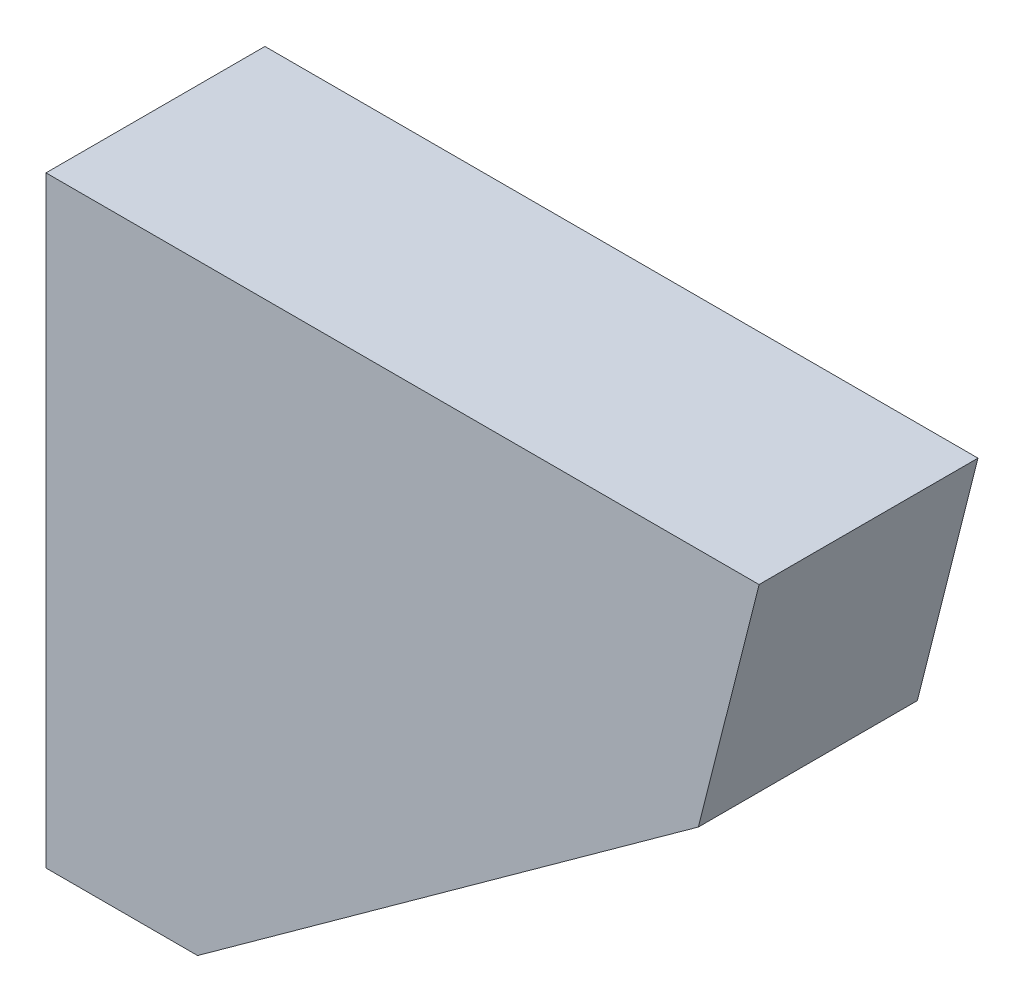
ISO-10303-21;
HEADER;
FILE_DESCRIPTION(('STEP AP214'),'2;1');
FILE_NAME('part.step','',(''),(''),'','','');
FILE_SCHEMA(('AUTOMOTIVE_DESIGN { 1 0 10303 214 1 1 1 1 }'));
ENDSEC;
DATA;
#1=APPLICATION_CONTEXT('core data for automotive mechanical design processes');
#2=APPLICATION_PROTOCOL_DEFINITION('international standard','automotive_design',2000,#1);
#3=PRODUCT_CONTEXT('',#1,'mechanical');
#4=PRODUCT('Part','Part','',(#3));
#5=PRODUCT_RELATED_PRODUCT_CATEGORY('part','',(#4));
#6=PRODUCT_DEFINITION_FORMATION('','',#4);
#7=PRODUCT_DEFINITION_CONTEXT('part definition',#1,'design');
#8=PRODUCT_DEFINITION('design','',#6,#7);
#9=PRODUCT_DEFINITION_SHAPE('','',#8);
#10=(LENGTH_UNIT() NAMED_UNIT(*) SI_UNIT(.MILLI.,.METRE.));
#11=(NAMED_UNIT(*) PLANE_ANGLE_UNIT() SI_UNIT($,.RADIAN.));
#12=(NAMED_UNIT(*) SI_UNIT($,.STERADIAN.) SOLID_ANGLE_UNIT());
#13=UNCERTAINTY_MEASURE_WITH_UNIT(LENGTH_MEASURE(1.E-05),#10,'distance_accuracy_value','');
#14=(GEOMETRIC_REPRESENTATION_CONTEXT(3) GLOBAL_UNCERTAINTY_ASSIGNED_CONTEXT((#13)) GLOBAL_UNIT_ASSIGNED_CONTEXT((#10,
#11,#12)) REPRESENTATION_CONTEXT('',''));
#15=CARTESIAN_POINT('',(0.,0.,0.));
#16=DIRECTION('',(0.,0.,1.));
#17=DIRECTION('',(1.,0.,0.));
#18=AXIS2_PLACEMENT_3D('',#15,#16,#17);
#19=CARTESIAN_POINT('',(0.,0.,8.));
#20=DIRECTION('',(0.,-1.,0.));
#21=DIRECTION('',(0.,0.,-1.));
#22=AXIS2_PLACEMENT_3D('',#19,#20,#21);
#23=PLANE('',#22);
#24=DIRECTION('',(-1.,0.,0.));
#25=VECTOR('',#24,1.);
#26=CARTESIAN_POINT('',(0.,0.,8.));
#27=LINE('',#26,#25);
#28=CARTESIAN_POINT('',(26.0559498624795,0.,8.));
#29=VERTEX_POINT('',#28);
#30=CARTESIAN_POINT('',(0.,0.,8.));
#31=VERTEX_POINT('',#30);
#32=EDGE_CURVE('E78',#29,#31,#27,.T.);
#33=ORIENTED_EDGE('',*,*,#32,.F.);
#34=DIRECTION('',(0.,0.,-1.));
#35=VECTOR('',#34,1.);
#36=CARTESIAN_POINT('',(26.0559498624795,0.,8.));
#37=LINE('',#36,#35);
#38=CARTESIAN_POINT('',(26.0559498624795,0.,0.));
#39=VERTEX_POINT('',#38);
#40=EDGE_CURVE('E114',#29,#39,#37,.T.);
#41=ORIENTED_EDGE('',*,*,#40,.T.);
#42=DIRECTION('',(-1.,0.,0.));
#43=VECTOR('',#42,1.);
#44=CARTESIAN_POINT('',(0.,0.,0.));
#45=LINE('',#44,#43);
#46=CARTESIAN_POINT('',(0.,0.,0.));
#47=VERTEX_POINT('',#46);
#48=EDGE_CURVE('E99',#39,#47,#45,.T.);
#49=ORIENTED_EDGE('',*,*,#48,.T.);
#50=DIRECTION('',(0.,0.,-1.));
#51=VECTOR('',#50,1.);
#52=CARTESIAN_POINT('',(0.,0.,8.));
#53=LINE('',#52,#51);
#54=EDGE_CURVE('E94',#31,#47,#53,.T.);
#55=ORIENTED_EDGE('',*,*,#54,.F.);
#56=EDGE_LOOP('',(#33,#41,#49,#55));
#57=FACE_BOUND('',#56,.T.);
#58=ADVANCED_FACE('F31',(#57),#23,.F.);
#59=CARTESIAN_POINT('',(0.,0.,8.));
#60=DIRECTION('',(1.,0.,0.));
#61=DIRECTION('',(0.,1.,0.));
#62=AXIS2_PLACEMENT_3D('',#59,#60,#61);
#63=PLANE('',#62);
#64=DIRECTION('',(0.,-1.,0.));
#65=VECTOR('',#64,1.);
#66=CARTESIAN_POINT('',(0.,0.,0.));
#67=LINE('',#66,#65);
#68=CARTESIAN_POINT('',(0.,-22.,0.));
#69=VERTEX_POINT('',#68);
#70=EDGE_CURVE('E118',#47,#69,#67,.T.);
#71=ORIENTED_EDGE('',*,*,#70,.T.);
#72=DIRECTION('',(0.,0.,1.));
#73=VECTOR('',#72,1.);
#74=CARTESIAN_POINT('',(0.,-22.,8.));
#75=LINE('',#74,#73);
#76=CARTESIAN_POINT('',(0.,-22.,8.));
#77=VERTEX_POINT('',#76);
#78=EDGE_CURVE('E96',#69,#77,#75,.T.);
#79=ORIENTED_EDGE('',*,*,#78,.T.);
#80=DIRECTION('',(0.,-1.,0.));
#81=VECTOR('',#80,1.);
#82=CARTESIAN_POINT('',(0.,0.,8.));
#83=LINE('',#82,#81);
#84=EDGE_CURVE('E81',#31,#77,#83,.T.);
#85=ORIENTED_EDGE('',*,*,#84,.F.);
#86=ORIENTED_EDGE('',*,*,#54,.T.);
#87=EDGE_LOOP('',(#71,#79,#85,#86));
#88=FACE_BOUND('',#87,.T.);
#89=ADVANCED_FACE('F93',(#88),#63,.F.);
#90=CARTESIAN_POINT('',(36.,0.,8.));
#91=DIRECTION('',(-0.585490553844359,0.810679228399881,0.));
#92=DIRECTION('',(-0.810679228399881,-0.585490553844359,0.));
#93=AXIS2_PLACEMENT_3D('',#90,#91,#92);
#94=PLANE('',#93);
#95=DIRECTION('',(0.810679228399881,0.585490553844359,0.));
#96=VECTOR('',#95,1.);
#97=CARTESIAN_POINT('',(36.,0.,0.));
#98=LINE('',#97,#96);
#99=CARTESIAN_POINT('',(5.53846153846153,-22.,0.));
#100=VERTEX_POINT('',#99);
#101=CARTESIAN_POINT('',(23.8398115740017,-8.78235830766542,0.));
#102=VERTEX_POINT('',#101);
#103=EDGE_CURVE('E88',#100,#102,#98,.T.);
#104=ORIENTED_EDGE('',*,*,#103,.T.);
#105=DIRECTION('',(0.,0.,1.));
#106=VECTOR('',#105,1.);
#107=CARTESIAN_POINT('',(23.8398115740017,-8.78235830766542,8.));
#108=LINE('',#107,#106);
#109=CARTESIAN_POINT('',(23.8398115740017,-8.78235830766542,8.));
#110=VERTEX_POINT('',#109);
#111=EDGE_CURVE('E39',#102,#110,#108,.T.);
#112=ORIENTED_EDGE('',*,*,#111,.T.);
#113=DIRECTION('',(0.810679228399881,0.585490553844359,0.));
#114=VECTOR('',#113,1.);
#115=CARTESIAN_POINT('',(36.,0.,8.));
#116=LINE('',#115,#114);
#117=CARTESIAN_POINT('',(5.53846153846153,-22.,8.));
#118=VERTEX_POINT('',#117);
#119=EDGE_CURVE('E97',#118,#110,#116,.T.);
#120=ORIENTED_EDGE('',*,*,#119,.F.);
#121=DIRECTION('',(0.,0.,-1.));
#122=VECTOR('',#121,1.);
#123=CARTESIAN_POINT('',(5.53846153846153,-22.,8.));
#124=LINE('',#123,#122);
#125=EDGE_CURVE('E101',#118,#100,#124,.T.);
#126=ORIENTED_EDGE('',*,*,#125,.T.);
#127=EDGE_LOOP('',(#104,#112,#120,#126));
#128=FACE_BOUND('',#127,.T.);
#129=ADVANCED_FACE('F120',(#128),#94,.F.);
#130=CARTESIAN_POINT('',(0.,0.,8.));
#131=DIRECTION('',(0.,0.,-1.));
#132=DIRECTION('',(-1.,0.,0.));
#133=AXIS2_PLACEMENT_3D('',#130,#131,#132);
#134=PLANE('',#133);
#135=ORIENTED_EDGE('',*,*,#119,.T.);
#136=DIRECTION('',(-0.244670244468048,-0.969606348716811,0.));
#137=VECTOR('',#136,1.);
#138=CARTESIAN_POINT('',(26.0559498624795,0.,8.));
#139=LINE('',#138,#137);
#140=EDGE_CURVE('E11',#110,#29,#139,.F.);
#141=ORIENTED_EDGE('',*,*,#140,.T.);
#142=ORIENTED_EDGE('',*,*,#32,.T.);
#143=ORIENTED_EDGE('',*,*,#84,.T.);
#144=DIRECTION('',(-1.,0.,0.));
#145=VECTOR('',#144,1.);
#146=CARTESIAN_POINT('',(5.53846153846153,-22.,8.));
#147=LINE('',#146,#145);
#148=EDGE_CURVE('E112',#77,#118,#147,.F.);
#149=ORIENTED_EDGE('',*,*,#148,.T.);
#150=EDGE_LOOP('',(#135,#141,#142,#143,#149));
#151=FACE_BOUND('',#150,.T.);
#152=ADVANCED_FACE('F80',(#151),#134,.F.);
#153=CARTESIAN_POINT('',(0.,0.,0.));
#154=DIRECTION('',(0.,0.,-1.));
#155=DIRECTION('',(-1.,0.,0.));
#156=AXIS2_PLACEMENT_3D('',#153,#154,#155);
#157=PLANE('',#156);
#158=ORIENTED_EDGE('',*,*,#48,.F.);
#159=DIRECTION('',(0.244670244468048,0.969606348716811,0.));
#160=VECTOR('',#159,1.);
#161=CARTESIAN_POINT('',(24.4961487645614,-6.18135258157369,0.));
#162=LINE('',#161,#160);
#163=EDGE_CURVE('E53',#39,#102,#162,.F.);
#164=ORIENTED_EDGE('',*,*,#163,.T.);
#165=ORIENTED_EDGE('',*,*,#103,.F.);
#166=DIRECTION('',(1.,0.,0.));
#167=VECTOR('',#166,1.);
#168=CARTESIAN_POINT('',(0.,-22.,0.));
#169=LINE('',#168,#167);
#170=EDGE_CURVE('E104',#100,#69,#169,.F.);
#171=ORIENTED_EDGE('',*,*,#170,.T.);
#172=ORIENTED_EDGE('',*,*,#70,.F.);
#173=EDGE_LOOP('',(#158,#164,#165,#171,#172));
#174=FACE_BOUND('',#173,.T.);
#175=ADVANCED_FACE('F117',(#174),#157,.T.);
#176=CARTESIAN_POINT('',(5.53846153846153,-22.,8.));
#177=DIRECTION('',(0.,1.,0.));
#178=DIRECTION('',(-1.,0.,0.));
#179=AXIS2_PLACEMENT_3D('',#176,#177,#178);
#180=PLANE('',#179);
#181=ORIENTED_EDGE('',*,*,#148,.F.);
#182=ORIENTED_EDGE('',*,*,#78,.F.);
#183=ORIENTED_EDGE('',*,*,#170,.F.);
#184=ORIENTED_EDGE('',*,*,#125,.F.);
#185=EDGE_LOOP('',(#181,#182,#183,#184));
#186=FACE_BOUND('',#185,.T.);
#187=ADVANCED_FACE('F123',(#186),#180,.F.);
#188=CARTESIAN_POINT('',(26.0559498624795,0.,8.));
#189=DIRECTION('',(-0.969606348716811,0.244670244468047,0.));
#190=DIRECTION('',(-0.244670244468048,-0.969606348716811,0.));
#191=AXIS2_PLACEMENT_3D('',#188,#189,#190);
#192=PLANE('',#191);
#193=ORIENTED_EDGE('',*,*,#140,.F.);
#194=ORIENTED_EDGE('',*,*,#111,.F.);
#195=ORIENTED_EDGE('',*,*,#163,.F.);
#196=ORIENTED_EDGE('',*,*,#40,.F.);
#197=EDGE_LOOP('',(#193,#194,#195,#196));
#198=FACE_BOUND('',#197,.T.);
#199=ADVANCED_FACE('F33',(#198),#192,.F.);
#200=CLOSED_SHELL('',(#58,#89,#129,#152,#175,#187,#199));
#201=MANIFOLD_SOLID_BREP('B2',#200);
#202=ADVANCED_BREP_SHAPE_REPRESENTATION('',(#18,#201),#14);
#203=SHAPE_DEFINITION_REPRESENTATION(#9,#202);
ENDSEC;
END-ISO-10303-21;
